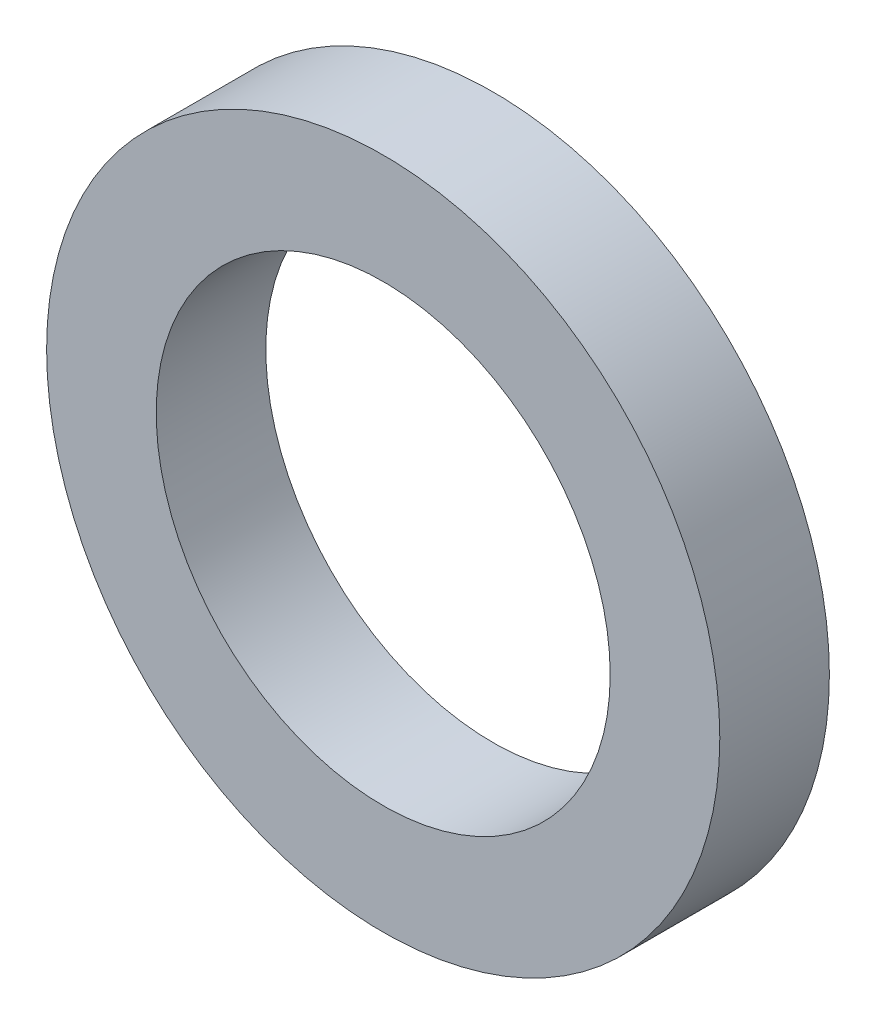
ISO-10303-21;
HEADER;
FILE_DESCRIPTION(('STEP AP214'),'2;1');
FILE_NAME('part.step','',(''),(''),'','','');
FILE_SCHEMA(('AUTOMOTIVE_DESIGN { 1 0 10303 214 1 1 1 1 }'));
ENDSEC;
DATA;
#1=APPLICATION_CONTEXT('core data for automotive mechanical design processes');
#2=APPLICATION_PROTOCOL_DEFINITION('international standard','automotive_design',2000,#1);
#3=PRODUCT_CONTEXT('',#1,'mechanical');
#4=PRODUCT('Part','Part','',(#3));
#5=PRODUCT_RELATED_PRODUCT_CATEGORY('part','',(#4));
#6=PRODUCT_DEFINITION_FORMATION('','',#4);
#7=PRODUCT_DEFINITION_CONTEXT('part definition',#1,'design');
#8=PRODUCT_DEFINITION('design','',#6,#7);
#9=PRODUCT_DEFINITION_SHAPE('','',#8);
#10=(LENGTH_UNIT() NAMED_UNIT(*) SI_UNIT(.MILLI.,.METRE.));
#11=(NAMED_UNIT(*) PLANE_ANGLE_UNIT() SI_UNIT($,.RADIAN.));
#12=(NAMED_UNIT(*) SI_UNIT($,.STERADIAN.) SOLID_ANGLE_UNIT());
#13=UNCERTAINTY_MEASURE_WITH_UNIT(LENGTH_MEASURE(1.E-05),#10,'distance_accuracy_value','');
#14=(GEOMETRIC_REPRESENTATION_CONTEXT(3) GLOBAL_UNCERTAINTY_ASSIGNED_CONTEXT((#13)) GLOBAL_UNIT_ASSIGNED_CONTEXT((#10,
#11,#12)) REPRESENTATION_CONTEXT('',''));
#15=CARTESIAN_POINT('',(0.,0.,0.));
#16=DIRECTION('',(0.,0.,1.));
#17=DIRECTION('',(1.,0.,0.));
#18=AXIS2_PLACEMENT_3D('',#15,#16,#17);
#19=CARTESIAN_POINT('',(0.,0.,7.));
#20=DIRECTION('',(0.,0.,1.));
#21=DIRECTION('',(1.,0.,0.));
#22=AXIS2_PLACEMENT_3D('',#19,#20,#21);
#23=PLANE('',#22);
#24=CARTESIAN_POINT('',(0.,0.,7.));
#25=DIRECTION('',(0.,0.,1.));
#26=DIRECTION('',(1.,0.,0.));
#27=AXIS2_PLACEMENT_3D('',#24,#25,#26);
#28=CIRCLE('',#27,21.5);
#29=CARTESIAN_POINT('',(21.5,0.,7.));
#30=VERTEX_POINT('',#29);
#31=EDGE_CURVE('E10',#30,#30,#28,.T.);
#32=ORIENTED_EDGE('',*,*,#31,.T.);
#33=EDGE_LOOP('',(#32));
#34=FACE_BOUND('',#33,.T.);
#35=CARTESIAN_POINT('',(0.,0.,7.));
#36=DIRECTION('',(0.,0.,1.));
#37=DIRECTION('',(1.,0.,0.));
#38=AXIS2_PLACEMENT_3D('',#35,#36,#37);
#39=CIRCLE('',#38,14.5);
#40=CARTESIAN_POINT('',(14.5,0.,7.));
#41=VERTEX_POINT('',#40);
#42=EDGE_CURVE('E43',#41,#41,#39,.T.);
#43=ORIENTED_EDGE('',*,*,#42,.F.);
#44=EDGE_LOOP('',(#43));
#45=FACE_BOUND('',#44,.T.);
#46=ADVANCED_FACE('F32',(#34,#45),#23,.T.);
#47=CARTESIAN_POINT('',(0.,0.,0.));
#48=DIRECTION('',(0.,0.,1.));
#49=DIRECTION('',(1.,0.,0.));
#50=AXIS2_PLACEMENT_3D('',#47,#48,#49);
#51=PLANE('',#50);
#52=CARTESIAN_POINT('',(0.,0.,0.));
#53=DIRECTION('',(0.,0.,1.));
#54=DIRECTION('',(1.,0.,0.));
#55=AXIS2_PLACEMENT_3D('',#52,#53,#54);
#56=CIRCLE('',#55,21.5);
#57=CARTESIAN_POINT('',(21.5,0.,0.));
#58=VERTEX_POINT('',#57);
#59=EDGE_CURVE('E36',#58,#58,#56,.T.);
#60=ORIENTED_EDGE('',*,*,#59,.F.);
#61=EDGE_LOOP('',(#60));
#62=FACE_BOUND('',#61,.T.);
#63=CARTESIAN_POINT('',(0.,0.,0.));
#64=DIRECTION('',(0.,0.,1.));
#65=DIRECTION('',(1.,0.,0.));
#66=AXIS2_PLACEMENT_3D('',#63,#64,#65);
#67=CIRCLE('',#66,14.5);
#68=CARTESIAN_POINT('',(14.5,0.,0.));
#69=VERTEX_POINT('',#68);
#70=EDGE_CURVE('E45',#69,#69,#67,.T.);
#71=ORIENTED_EDGE('',*,*,#70,.T.);
#72=EDGE_LOOP('',(#71));
#73=FACE_BOUND('',#72,.T.);
#74=ADVANCED_FACE('F55',(#62,#73),#51,.F.);
#75=CARTESIAN_POINT('',(0.,0.,7.));
#76=DIRECTION('',(0.,0.,-1.));
#77=DIRECTION('',(-1.,0.,0.));
#78=AXIS2_PLACEMENT_3D('',#75,#76,#77);
#79=CYLINDRICAL_SURFACE('',#78,21.5);
#80=ORIENTED_EDGE('',*,*,#31,.F.);
#81=EDGE_LOOP('',(#80));
#82=FACE_BOUND('',#81,.T.);
#83=ORIENTED_EDGE('',*,*,#59,.T.);
#84=EDGE_LOOP('',(#83));
#85=FACE_BOUND('',#84,.T.);
#86=ADVANCED_FACE('F34',(#82,#85),#79,.T.);
#87=CARTESIAN_POINT('',(0.,0.,7.));
#88=DIRECTION('',(0.,0.,-1.));
#89=DIRECTION('',(-1.,0.,0.));
#90=AXIS2_PLACEMENT_3D('',#87,#88,#89);
#91=CYLINDRICAL_SURFACE('',#90,14.5);
#92=ORIENTED_EDGE('',*,*,#42,.T.);
#93=EDGE_LOOP('',(#92));
#94=FACE_BOUND('',#93,.T.);
#95=ORIENTED_EDGE('',*,*,#70,.F.);
#96=EDGE_LOOP('',(#95));
#97=FACE_BOUND('',#96,.T.);
#98=ADVANCED_FACE('F51',(#94,#97),#91,.F.);
#99=CLOSED_SHELL('',(#46,#74,#86,#98));
#100=MANIFOLD_SOLID_BREP('B2',#99);
#101=ADVANCED_BREP_SHAPE_REPRESENTATION('',(#18,#100),#14);
#102=SHAPE_DEFINITION_REPRESENTATION(#9,#101);
ENDSEC;
END-ISO-10303-21;
